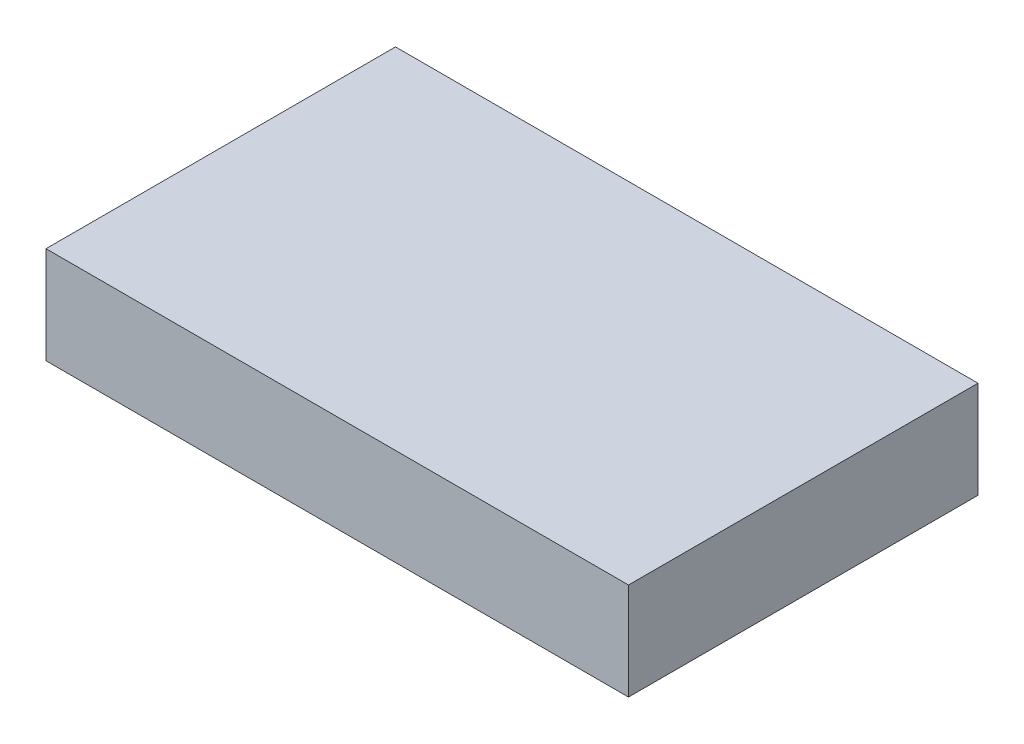
ISO-10303-21;
HEADER;
FILE_DESCRIPTION(('STEP AP214'),'2;1');
FILE_NAME('part.step','',(''),(''),'','','');
FILE_SCHEMA(('AUTOMOTIVE_DESIGN { 1 0 10303 214 1 1 1 1 }'));
ENDSEC;
DATA;
#1=APPLICATION_CONTEXT('core data for automotive mechanical design processes');
#2=APPLICATION_PROTOCOL_DEFINITION('international standard','automotive_design',2000,#1);
#3=PRODUCT_CONTEXT('',#1,'mechanical');
#4=PRODUCT('Part','Part','',(#3));
#5=PRODUCT_RELATED_PRODUCT_CATEGORY('part','',(#4));
#6=PRODUCT_DEFINITION_FORMATION('','',#4);
#7=PRODUCT_DEFINITION_CONTEXT('part definition',#1,'design');
#8=PRODUCT_DEFINITION('design','',#6,#7);
#9=PRODUCT_DEFINITION_SHAPE('','',#8);
#10=(LENGTH_UNIT() NAMED_UNIT(*) SI_UNIT(.MILLI.,.METRE.));
#11=(NAMED_UNIT(*) PLANE_ANGLE_UNIT() SI_UNIT($,.RADIAN.));
#12=(NAMED_UNIT(*) SI_UNIT($,.STERADIAN.) SOLID_ANGLE_UNIT());
#13=UNCERTAINTY_MEASURE_WITH_UNIT(LENGTH_MEASURE(1.E-05),#10,'distance_accuracy_value','');
#14=(GEOMETRIC_REPRESENTATION_CONTEXT(3) GLOBAL_UNCERTAINTY_ASSIGNED_CONTEXT((#13)) GLOBAL_UNIT_ASSIGNED_CONTEXT((#10,
#11,#12)) REPRESENTATION_CONTEXT('',''));
#15=CARTESIAN_POINT('',(0.,0.,0.));
#16=DIRECTION('',(0.,0.,1.));
#17=DIRECTION('',(1.,0.,0.));
#18=AXIS2_PLACEMENT_3D('',#15,#16,#17);
#19=CARTESIAN_POINT('',(0.,0.,90.));
#20=DIRECTION('',(1.,0.,0.));
#21=DIRECTION('',(0.,0.,-1.));
#22=AXIS2_PLACEMENT_3D('',#19,#20,#21);
#23=PLANE('',#22);
#24=DIRECTION('',(0.,-1.,0.));
#25=VECTOR('',#24,1.);
#26=CARTESIAN_POINT('',(0.,0.,0.));
#27=LINE('',#26,#25);
#28=CARTESIAN_POINT('',(0.,25.,0.));
#29=VERTEX_POINT('',#28);
#30=CARTESIAN_POINT('',(0.,0.,0.));
#31=VERTEX_POINT('',#30);
#32=EDGE_CURVE('E114',#29,#31,#27,.T.);
#33=ORIENTED_EDGE('',*,*,#32,.T.);
#34=DIRECTION('',(0.,0.,-1.));
#35=VECTOR('',#34,1.);
#36=CARTESIAN_POINT('',(0.,0.,90.));
#37=LINE('',#36,#35);
#38=CARTESIAN_POINT('',(0.,0.,90.));
#39=VERTEX_POINT('',#38);
#40=EDGE_CURVE('E11',#39,#31,#37,.T.);
#41=ORIENTED_EDGE('',*,*,#40,.F.);
#42=DIRECTION('',(0.,-1.,0.));
#43=VECTOR('',#42,1.);
#44=CARTESIAN_POINT('',(0.,0.,90.));
#45=LINE('',#44,#43);
#46=CARTESIAN_POINT('',(0.,25.,90.));
#47=VERTEX_POINT('',#46);
#48=EDGE_CURVE('E100',#47,#39,#45,.T.);
#49=ORIENTED_EDGE('',*,*,#48,.F.);
#50=DIRECTION('',(0.,0.,-1.));
#51=VECTOR('',#50,1.);
#52=CARTESIAN_POINT('',(0.,25.,90.));
#53=LINE('',#52,#51);
#54=EDGE_CURVE('E108',#47,#29,#53,.T.);
#55=ORIENTED_EDGE('',*,*,#54,.T.);
#56=EDGE_LOOP('',(#33,#41,#49,#55));
#57=FACE_BOUND('',#56,.T.);
#58=ADVANCED_FACE('F44',(#57),#23,.F.);
#59=CARTESIAN_POINT('',(0.,0.,90.));
#60=DIRECTION('',(0.,1.,0.));
#61=DIRECTION('',(0.,0.,1.));
#62=AXIS2_PLACEMENT_3D('',#59,#60,#61);
#63=PLANE('',#62);
#64=DIRECTION('',(1.,0.,0.));
#65=VECTOR('',#64,1.);
#66=CARTESIAN_POINT('',(0.,0.,0.));
#67=LINE('',#66,#65);
#68=CARTESIAN_POINT('',(150.,0.,0.));
#69=VERTEX_POINT('',#68);
#70=EDGE_CURVE('E105',#31,#69,#67,.T.);
#71=ORIENTED_EDGE('',*,*,#70,.T.);
#72=DIRECTION('',(0.,0.,-1.));
#73=VECTOR('',#72,1.);
#74=CARTESIAN_POINT('',(150.,0.,90.));
#75=LINE('',#74,#73);
#76=CARTESIAN_POINT('',(150.,0.,90.));
#77=VERTEX_POINT('',#76);
#78=EDGE_CURVE('E53',#77,#69,#75,.T.);
#79=ORIENTED_EDGE('',*,*,#78,.F.);
#80=DIRECTION('',(1.,0.,0.));
#81=VECTOR('',#80,1.);
#82=CARTESIAN_POINT('',(0.,0.,90.));
#83=LINE('',#82,#81);
#84=EDGE_CURVE('E95',#39,#77,#83,.T.);
#85=ORIENTED_EDGE('',*,*,#84,.F.);
#86=ORIENTED_EDGE('',*,*,#40,.T.);
#87=EDGE_LOOP('',(#71,#79,#85,#86));
#88=FACE_BOUND('',#87,.T.);
#89=ADVANCED_FACE('F101',(#88),#63,.F.);
#90=CARTESIAN_POINT('',(150.,0.,90.));
#91=DIRECTION('',(-1.,0.,0.));
#92=DIRECTION('',(0.,0.,1.));
#93=AXIS2_PLACEMENT_3D('',#90,#91,#92);
#94=PLANE('',#93);
#95=DIRECTION('',(0.,1.,0.));
#96=VECTOR('',#95,1.);
#97=CARTESIAN_POINT('',(150.,0.,0.));
#98=LINE('',#97,#96);
#99=CARTESIAN_POINT('',(150.,25.,0.));
#100=VERTEX_POINT('',#99);
#101=EDGE_CURVE('E80',#69,#100,#98,.T.);
#102=ORIENTED_EDGE('',*,*,#101,.T.);
#103=DIRECTION('',(0.,0.,-1.));
#104=VECTOR('',#103,1.);
#105=CARTESIAN_POINT('',(150.,25.,90.));
#106=LINE('',#105,#104);
#107=CARTESIAN_POINT('',(150.,25.,90.));
#108=VERTEX_POINT('',#107);
#109=EDGE_CURVE('E102',#108,#100,#106,.T.);
#110=ORIENTED_EDGE('',*,*,#109,.F.);
#111=DIRECTION('',(0.,1.,0.));
#112=VECTOR('',#111,1.);
#113=CARTESIAN_POINT('',(150.,0.,90.));
#114=LINE('',#113,#112);
#115=EDGE_CURVE('E92',#77,#108,#114,.T.);
#116=ORIENTED_EDGE('',*,*,#115,.F.);
#117=ORIENTED_EDGE('',*,*,#78,.T.);
#118=EDGE_LOOP('',(#102,#110,#116,#117));
#119=FACE_BOUND('',#118,.T.);
#120=ADVANCED_FACE('F104',(#119),#94,.F.);
#121=CARTESIAN_POINT('',(0.,25.,90.));
#122=DIRECTION('',(0.,-1.,0.));
#123=DIRECTION('',(0.,0.,-1.));
#124=AXIS2_PLACEMENT_3D('',#121,#122,#123);
#125=PLANE('',#124);
#126=DIRECTION('',(-1.,0.,0.));
#127=VECTOR('',#126,1.);
#128=CARTESIAN_POINT('',(0.,25.,0.));
#129=LINE('',#128,#127);
#130=EDGE_CURVE('E84',#100,#29,#129,.T.);
#131=ORIENTED_EDGE('',*,*,#130,.T.);
#132=ORIENTED_EDGE('',*,*,#54,.F.);
#133=DIRECTION('',(-1.,0.,0.));
#134=VECTOR('',#133,1.);
#135=CARTESIAN_POINT('',(0.,25.,90.));
#136=LINE('',#135,#134);
#137=EDGE_CURVE('E64',#108,#47,#136,.T.);
#138=ORIENTED_EDGE('',*,*,#137,.F.);
#139=ORIENTED_EDGE('',*,*,#109,.T.);
#140=EDGE_LOOP('',(#131,#132,#138,#139));
#141=FACE_BOUND('',#140,.T.);
#142=ADVANCED_FACE('F127',(#141),#125,.F.);
#143=CARTESIAN_POINT('',(0.,0.,90.));
#144=DIRECTION('',(0.,0.,-1.));
#145=DIRECTION('',(-1.,0.,0.));
#146=AXIS2_PLACEMENT_3D('',#143,#144,#145);
#147=PLANE('',#146);
#148=ORIENTED_EDGE('',*,*,#48,.T.);
#149=ORIENTED_EDGE('',*,*,#84,.T.);
#150=ORIENTED_EDGE('',*,*,#115,.T.);
#151=ORIENTED_EDGE('',*,*,#137,.T.);
#152=EDGE_LOOP('',(#148,#149,#150,#151));
#153=FACE_BOUND('',#152,.T.);
#154=ADVANCED_FACE('F91',(#153),#147,.F.);
#155=CARTESIAN_POINT('',(0.,0.,0.));
#156=DIRECTION('',(0.,0.,-1.));
#157=DIRECTION('',(-1.,0.,0.));
#158=AXIS2_PLACEMENT_3D('',#155,#156,#157);
#159=PLANE('',#158);
#160=ORIENTED_EDGE('',*,*,#32,.F.);
#161=ORIENTED_EDGE('',*,*,#130,.F.);
#162=ORIENTED_EDGE('',*,*,#101,.F.);
#163=ORIENTED_EDGE('',*,*,#70,.F.);
#164=EDGE_LOOP('',(#160,#161,#162,#163));
#165=FACE_BOUND('',#164,.T.);
#166=ADVANCED_FACE('F129',(#165),#159,.T.);
#167=CLOSED_SHELL('',(#58,#89,#120,#142,#154,#166));
#168=MANIFOLD_SOLID_BREP('B2',#167);
#169=ADVANCED_BREP_SHAPE_REPRESENTATION('',(#18,#168),#14);
#170=SHAPE_DEFINITION_REPRESENTATION(#9,#169);
ENDSEC;
END-ISO-10303-21;
